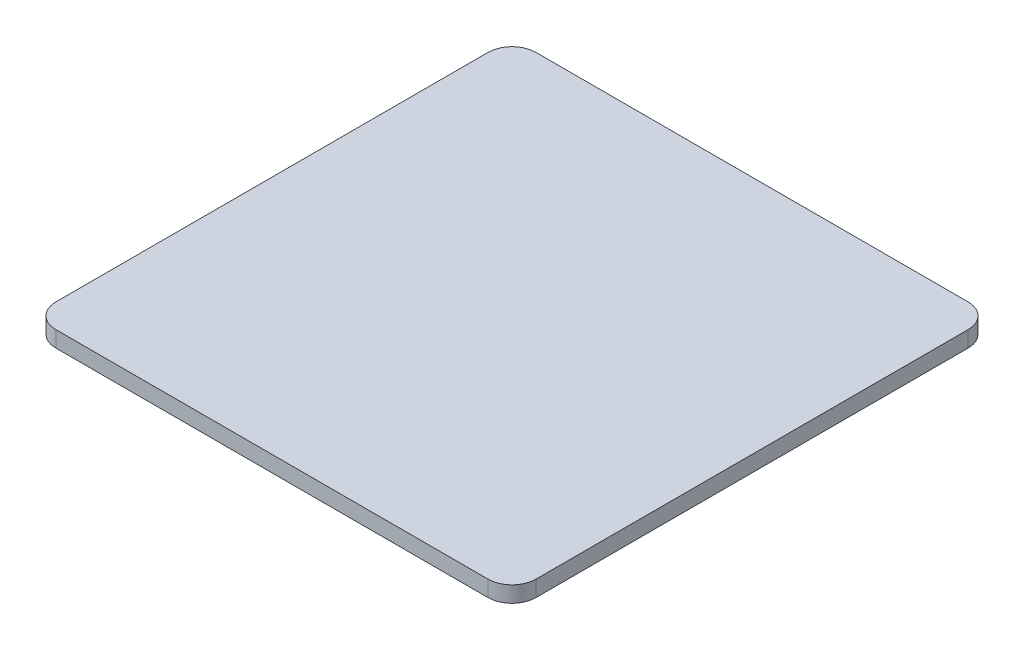
ISO-10303-21;
HEADER;
FILE_DESCRIPTION(('STEP AP214'),'2;1');
FILE_NAME('part.step','',(''),(''),'','','');
FILE_SCHEMA(('AUTOMOTIVE_DESIGN { 1 0 10303 214 1 1 1 1 }'));
ENDSEC;
DATA;
#1=APPLICATION_CONTEXT('core data for automotive mechanical design processes');
#2=APPLICATION_PROTOCOL_DEFINITION('international standard','automotive_design',2000,#1);
#3=PRODUCT_CONTEXT('',#1,'mechanical');
#4=PRODUCT('Part','Part','',(#3));
#5=PRODUCT_RELATED_PRODUCT_CATEGORY('part','',(#4));
#6=PRODUCT_DEFINITION_FORMATION('','',#4);
#7=PRODUCT_DEFINITION_CONTEXT('part definition',#1,'design');
#8=PRODUCT_DEFINITION('design','',#6,#7);
#9=PRODUCT_DEFINITION_SHAPE('','',#8);
#10=(LENGTH_UNIT() NAMED_UNIT(*) SI_UNIT(.MILLI.,.METRE.));
#11=(NAMED_UNIT(*) PLANE_ANGLE_UNIT() SI_UNIT($,.RADIAN.));
#12=(NAMED_UNIT(*) SI_UNIT($,.STERADIAN.) SOLID_ANGLE_UNIT());
#13=UNCERTAINTY_MEASURE_WITH_UNIT(LENGTH_MEASURE(1.E-05),#10,'distance_accuracy_value','');
#14=(GEOMETRIC_REPRESENTATION_CONTEXT(3) GLOBAL_UNCERTAINTY_ASSIGNED_CONTEXT((#13)) GLOBAL_UNIT_ASSIGNED_CONTEXT((#10,
#11,#12)) REPRESENTATION_CONTEXT('',''));
#15=CARTESIAN_POINT('',(0.,0.,0.));
#16=DIRECTION('',(0.,0.,1.));
#17=DIRECTION('',(1.,0.,0.));
#18=AXIS2_PLACEMENT_3D('',#15,#16,#17);
#19=CARTESIAN_POINT('',(-27.,-2.,27.));
#20=DIRECTION('',(0.,1.,0.));
#21=DIRECTION('',(0.,0.,1.));
#22=AXIS2_PLACEMENT_3D('',#19,#20,#21);
#23=CYLINDRICAL_SURFACE('',#22,3.);
#24=CARTESIAN_POINT('',(-27.,0.,27.));
#25=DIRECTION('',(0.,1.,0.));
#26=DIRECTION('',(0.,0.,-1.));
#27=AXIS2_PLACEMENT_3D('',#24,#25,#26);
#28=CIRCLE('',#27,3.);
#29=CARTESIAN_POINT('',(-30.,0.,27.));
#30=VERTEX_POINT('',#29);
#31=CARTESIAN_POINT('',(-27.,0.,30.));
#32=VERTEX_POINT('',#31);
#33=EDGE_CURVE('E136',#30,#32,#28,.T.);
#34=ORIENTED_EDGE('',*,*,#33,.F.);
#35=DIRECTION('',(0.,1.,0.));
#36=VECTOR('',#35,1.);
#37=CARTESIAN_POINT('',(-30.,-2.,27.));
#38=LINE('',#37,#36);
#39=CARTESIAN_POINT('',(-30.,-2.,27.));
#40=VERTEX_POINT('',#39);
#41=EDGE_CURVE('E11',#40,#30,#38,.T.);
#42=ORIENTED_EDGE('',*,*,#41,.F.);
#43=CARTESIAN_POINT('',(-27.,-2.,27.));
#44=DIRECTION('',(0.,1.,0.));
#45=DIRECTION('',(0.,0.,-1.));
#46=AXIS2_PLACEMENT_3D('',#43,#44,#45);
#47=CIRCLE('',#46,3.);
#48=CARTESIAN_POINT('',(-27.,-2.,30.));
#49=VERTEX_POINT('',#48);
#50=EDGE_CURVE('E156',#40,#49,#47,.T.);
#51=ORIENTED_EDGE('',*,*,#50,.T.);
#52=DIRECTION('',(0.,1.,0.));
#53=VECTOR('',#52,1.);
#54=CARTESIAN_POINT('',(-27.,-2.,30.));
#55=LINE('',#54,#53);
#56=EDGE_CURVE('E42',#49,#32,#55,.T.);
#57=ORIENTED_EDGE('',*,*,#56,.T.);
#58=EDGE_LOOP('',(#34,#42,#51,#57));
#59=FACE_BOUND('',#58,.T.);
#60=ADVANCED_FACE('F39',(#59),#23,.T.);
#61=CARTESIAN_POINT('',(-30.,-2.,-27.));
#62=DIRECTION('',(-1.,0.,0.));
#63=DIRECTION('',(0.,0.,1.));
#64=AXIS2_PLACEMENT_3D('',#61,#62,#63);
#65=PLANE('',#64);
#66=DIRECTION('',(0.,0.,1.));
#67=VECTOR('',#66,1.);
#68=CARTESIAN_POINT('',(-30.,0.,-27.));
#69=LINE('',#68,#67);
#70=CARTESIAN_POINT('',(-30.,0.,-27.));
#71=VERTEX_POINT('',#70);
#72=EDGE_CURVE('E154',#71,#30,#69,.T.);
#73=ORIENTED_EDGE('',*,*,#72,.F.);
#74=DIRECTION('',(0.,1.,0.));
#75=VECTOR('',#74,1.);
#76=CARTESIAN_POINT('',(-30.,-2.,-27.));
#77=LINE('',#76,#75);
#78=CARTESIAN_POINT('',(-30.,-2.,-27.));
#79=VERTEX_POINT('',#78);
#80=EDGE_CURVE('E48',#79,#71,#77,.T.);
#81=ORIENTED_EDGE('',*,*,#80,.F.);
#82=DIRECTION('',(0.,0.,1.));
#83=VECTOR('',#82,1.);
#84=CARTESIAN_POINT('',(-30.,-2.,-27.));
#85=LINE('',#84,#83);
#86=EDGE_CURVE('E126',#79,#40,#85,.T.);
#87=ORIENTED_EDGE('',*,*,#86,.T.);
#88=ORIENTED_EDGE('',*,*,#41,.T.);
#89=EDGE_LOOP('',(#73,#81,#87,#88));
#90=FACE_BOUND('',#89,.T.);
#91=ADVANCED_FACE('F168',(#90),#65,.T.);
#92=CARTESIAN_POINT('',(-27.,-2.,-27.));
#93=DIRECTION('',(0.,1.,0.));
#94=DIRECTION('',(0.,0.,1.));
#95=AXIS2_PLACEMENT_3D('',#92,#93,#94);
#96=CYLINDRICAL_SURFACE('',#95,3.);
#97=CARTESIAN_POINT('',(-27.,0.,-27.));
#98=DIRECTION('',(0.,1.,0.));
#99=DIRECTION('',(0.,0.,1.));
#100=AXIS2_PLACEMENT_3D('',#97,#98,#99);
#101=CIRCLE('',#100,3.);
#102=CARTESIAN_POINT('',(-27.,0.,-30.));
#103=VERTEX_POINT('',#102);
#104=EDGE_CURVE('E113',#103,#71,#101,.T.);
#105=ORIENTED_EDGE('',*,*,#104,.F.);
#106=DIRECTION('',(0.,1.,0.));
#107=VECTOR('',#106,1.);
#108=CARTESIAN_POINT('',(-27.,-2.,-30.));
#109=LINE('',#108,#107);
#110=CARTESIAN_POINT('',(-27.,-2.,-30.));
#111=VERTEX_POINT('',#110);
#112=EDGE_CURVE('E108',#111,#103,#109,.T.);
#113=ORIENTED_EDGE('',*,*,#112,.F.);
#114=CARTESIAN_POINT('',(-27.,-2.,-27.));
#115=DIRECTION('',(0.,1.,0.));
#116=DIRECTION('',(0.,0.,1.));
#117=AXIS2_PLACEMENT_3D('',#114,#115,#116);
#118=CIRCLE('',#117,3.);
#119=EDGE_CURVE('E111',#111,#79,#118,.T.);
#120=ORIENTED_EDGE('',*,*,#119,.T.);
#121=ORIENTED_EDGE('',*,*,#80,.T.);
#122=EDGE_LOOP('',(#105,#113,#120,#121));
#123=FACE_BOUND('',#122,.T.);
#124=ADVANCED_FACE('F110',(#123),#96,.T.);
#125=CARTESIAN_POINT('',(27.,-2.,-30.));
#126=DIRECTION('',(0.,0.,-1.));
#127=DIRECTION('',(-1.,0.,0.));
#128=AXIS2_PLACEMENT_3D('',#125,#126,#127);
#129=PLANE('',#128);
#130=DIRECTION('',(-1.,0.,0.));
#131=VECTOR('',#130,1.);
#132=CARTESIAN_POINT('',(27.,0.,-30.));
#133=LINE('',#132,#131);
#134=CARTESIAN_POINT('',(27.,0.,-30.));
#135=VERTEX_POINT('',#134);
#136=EDGE_CURVE('E151',#135,#103,#133,.T.);
#137=ORIENTED_EDGE('',*,*,#136,.F.);
#138=DIRECTION('',(0.,1.,0.));
#139=VECTOR('',#138,1.);
#140=CARTESIAN_POINT('',(27.,-2.,-30.));
#141=LINE('',#140,#139);
#142=CARTESIAN_POINT('',(27.,-2.,-30.));
#143=VERTEX_POINT('',#142);
#144=EDGE_CURVE('E118',#143,#135,#141,.T.);
#145=ORIENTED_EDGE('',*,*,#144,.F.);
#146=DIRECTION('',(-1.,0.,0.));
#147=VECTOR('',#146,1.);
#148=CARTESIAN_POINT('',(27.,-2.,-30.));
#149=LINE('',#148,#147);
#150=EDGE_CURVE('E124',#143,#111,#149,.T.);
#151=ORIENTED_EDGE('',*,*,#150,.T.);
#152=ORIENTED_EDGE('',*,*,#112,.T.);
#153=EDGE_LOOP('',(#137,#145,#151,#152));
#154=FACE_BOUND('',#153,.T.);
#155=ADVANCED_FACE('F128',(#154),#129,.T.);
#156=CARTESIAN_POINT('',(27.,-2.,-27.));
#157=DIRECTION('',(0.,1.,0.));
#158=DIRECTION('',(0.,0.,1.));
#159=AXIS2_PLACEMENT_3D('',#156,#157,#158);
#160=CYLINDRICAL_SURFACE('',#159,3.);
#161=CARTESIAN_POINT('',(27.,0.,-27.));
#162=DIRECTION('',(0.,1.,0.));
#163=DIRECTION('',(0.,0.,-1.));
#164=AXIS2_PLACEMENT_3D('',#161,#162,#163);
#165=CIRCLE('',#164,3.);
#166=CARTESIAN_POINT('',(30.,0.,-27.));
#167=VERTEX_POINT('',#166);
#168=EDGE_CURVE('E148',#167,#135,#165,.T.);
#169=ORIENTED_EDGE('',*,*,#168,.F.);
#170=DIRECTION('',(0.,1.,0.));
#171=VECTOR('',#170,1.);
#172=CARTESIAN_POINT('',(30.,-2.,-27.));
#173=LINE('',#172,#171);
#174=CARTESIAN_POINT('',(30.,-2.,-27.));
#175=VERTEX_POINT('',#174);
#176=EDGE_CURVE('E160',#175,#167,#173,.T.);
#177=ORIENTED_EDGE('',*,*,#176,.F.);
#178=CARTESIAN_POINT('',(27.,-2.,-27.));
#179=DIRECTION('',(0.,1.,0.));
#180=DIRECTION('',(0.,0.,-1.));
#181=AXIS2_PLACEMENT_3D('',#178,#179,#180);
#182=CIRCLE('',#181,3.);
#183=EDGE_CURVE('E129',#175,#143,#182,.T.);
#184=ORIENTED_EDGE('',*,*,#183,.T.);
#185=ORIENTED_EDGE('',*,*,#144,.T.);
#186=EDGE_LOOP('',(#169,#177,#184,#185));
#187=FACE_BOUND('',#186,.T.);
#188=ADVANCED_FACE('F181',(#187),#160,.T.);
#189=CARTESIAN_POINT('',(30.,-2.,-27.));
#190=DIRECTION('',(1.,0.,0.));
#191=DIRECTION('',(0.,0.,-1.));
#192=AXIS2_PLACEMENT_3D('',#189,#190,#191);
#193=PLANE('',#192);
#194=DIRECTION('',(0.,0.,-1.));
#195=VECTOR('',#194,1.);
#196=CARTESIAN_POINT('',(30.,0.,-27.));
#197=LINE('',#196,#195);
#198=CARTESIAN_POINT('',(30.,0.,27.));
#199=VERTEX_POINT('',#198);
#200=EDGE_CURVE('E145',#199,#167,#197,.T.);
#201=ORIENTED_EDGE('',*,*,#200,.F.);
#202=DIRECTION('',(0.,1.,0.));
#203=VECTOR('',#202,1.);
#204=CARTESIAN_POINT('',(30.,-2.,27.));
#205=LINE('',#204,#203);
#206=CARTESIAN_POINT('',(30.,-2.,27.));
#207=VERTEX_POINT('',#206);
#208=EDGE_CURVE('E162',#207,#199,#205,.T.);
#209=ORIENTED_EDGE('',*,*,#208,.F.);
#210=DIRECTION('',(0.,0.,-1.));
#211=VECTOR('',#210,1.);
#212=CARTESIAN_POINT('',(30.,-2.,-27.));
#213=LINE('',#212,#211);
#214=EDGE_CURVE('E131',#207,#175,#213,.T.);
#215=ORIENTED_EDGE('',*,*,#214,.T.);
#216=ORIENTED_EDGE('',*,*,#176,.T.);
#217=EDGE_LOOP('',(#201,#209,#215,#216));
#218=FACE_BOUND('',#217,.T.);
#219=ADVANCED_FACE('F184',(#218),#193,.T.);
#220=CARTESIAN_POINT('',(27.,-2.,27.));
#221=DIRECTION('',(0.,1.,0.));
#222=DIRECTION('',(0.,0.,1.));
#223=AXIS2_PLACEMENT_3D('',#220,#221,#222);
#224=CYLINDRICAL_SURFACE('',#223,3.);
#225=CARTESIAN_POINT('',(27.,0.,27.));
#226=DIRECTION('',(0.,1.,0.));
#227=DIRECTION('',(0.,0.,-1.));
#228=AXIS2_PLACEMENT_3D('',#225,#226,#227);
#229=CIRCLE('',#228,3.);
#230=CARTESIAN_POINT('',(27.,0.,30.));
#231=VERTEX_POINT('',#230);
#232=EDGE_CURVE('E142',#231,#199,#229,.T.);
#233=ORIENTED_EDGE('',*,*,#232,.F.);
#234=DIRECTION('',(0.,1.,0.));
#235=VECTOR('',#234,1.);
#236=CARTESIAN_POINT('',(27.,-2.,30.));
#237=LINE('',#236,#235);
#238=CARTESIAN_POINT('',(27.,-2.,30.));
#239=VERTEX_POINT('',#238);
#240=EDGE_CURVE('E163',#239,#231,#237,.T.);
#241=ORIENTED_EDGE('',*,*,#240,.F.);
#242=CARTESIAN_POINT('',(27.,-2.,27.));
#243=DIRECTION('',(0.,1.,0.));
#244=DIRECTION('',(0.,0.,-1.));
#245=AXIS2_PLACEMENT_3D('',#242,#243,#244);
#246=CIRCLE('',#245,3.);
#247=EDGE_CURVE('E279',#239,#207,#246,.T.);
#248=ORIENTED_EDGE('',*,*,#247,.T.);
#249=ORIENTED_EDGE('',*,*,#208,.T.);
#250=EDGE_LOOP('',(#233,#241,#248,#249));
#251=FACE_BOUND('',#250,.T.);
#252=ADVANCED_FACE('F188',(#251),#224,.T.);
#253=CARTESIAN_POINT('',(27.,-2.,30.));
#254=DIRECTION('',(0.,0.,1.));
#255=DIRECTION('',(1.,0.,0.));
#256=AXIS2_PLACEMENT_3D('',#253,#254,#255);
#257=PLANE('',#256);
#258=DIRECTION('',(1.,0.,0.));
#259=VECTOR('',#258,1.);
#260=CARTESIAN_POINT('',(27.,0.,30.));
#261=LINE('',#260,#259);
#262=EDGE_CURVE('E139',#32,#231,#261,.T.);
#263=ORIENTED_EDGE('',*,*,#262,.F.);
#264=ORIENTED_EDGE('',*,*,#56,.F.);
#265=DIRECTION('',(1.,0.,0.));
#266=VECTOR('',#265,1.);
#267=CARTESIAN_POINT('',(27.,-2.,30.));
#268=LINE('',#267,#266);
#269=EDGE_CURVE('E280',#49,#239,#268,.T.);
#270=ORIENTED_EDGE('',*,*,#269,.T.);
#271=ORIENTED_EDGE('',*,*,#240,.T.);
#272=EDGE_LOOP('',(#263,#264,#270,#271));
#273=FACE_BOUND('',#272,.T.);
#274=ADVANCED_FACE('F165',(#273),#257,.T.);
#275=CARTESIAN_POINT('',(-27.,-2.,27.));
#276=DIRECTION('',(0.,-1.,0.));
#277=DIRECTION('',(0.,0.,-1.));
#278=AXIS2_PLACEMENT_3D('',#275,#276,#277);
#279=PLANE('',#278);
#280=ORIENTED_EDGE('',*,*,#50,.F.);
#281=ORIENTED_EDGE('',*,*,#86,.F.);
#282=ORIENTED_EDGE('',*,*,#119,.F.);
#283=ORIENTED_EDGE('',*,*,#150,.F.);
#284=ORIENTED_EDGE('',*,*,#183,.F.);
#285=ORIENTED_EDGE('',*,*,#214,.F.);
#286=ORIENTED_EDGE('',*,*,#247,.F.);
#287=ORIENTED_EDGE('',*,*,#269,.F.);
#288=EDGE_LOOP('',(#280,#281,#282,#283,#284,#285,#286,#287));
#289=FACE_BOUND('',#288,.T.);
#290=ADVANCED_FACE('F122',(#289),#279,.T.);
#291=CARTESIAN_POINT('',(-27.,0.,27.));
#292=DIRECTION('',(0.,-1.,0.));
#293=DIRECTION('',(0.,0.,-1.));
#294=AXIS2_PLACEMENT_3D('',#291,#292,#293);
#295=PLANE('',#294);
#296=ORIENTED_EDGE('',*,*,#33,.T.);
#297=ORIENTED_EDGE('',*,*,#262,.T.);
#298=ORIENTED_EDGE('',*,*,#232,.T.);
#299=ORIENTED_EDGE('',*,*,#200,.T.);
#300=ORIENTED_EDGE('',*,*,#168,.T.);
#301=ORIENTED_EDGE('',*,*,#136,.T.);
#302=ORIENTED_EDGE('',*,*,#104,.T.);
#303=ORIENTED_EDGE('',*,*,#72,.T.);
#304=EDGE_LOOP('',(#296,#297,#298,#299,#300,#301,#302,#303));
#305=FACE_BOUND('',#304,.T.);
#306=ADVANCED_FACE('F167',(#305),#295,.F.);
#307=CLOSED_SHELL('',(#60,#91,#124,#155,#188,#219,#252,#274,#290,#306));
#308=MANIFOLD_SOLID_BREP('B2',#307);
#309=ADVANCED_BREP_SHAPE_REPRESENTATION('',(#18,#308),#14);
#310=SHAPE_DEFINITION_REPRESENTATION(#9,#309);
ENDSEC;
END-ISO-10303-21;
